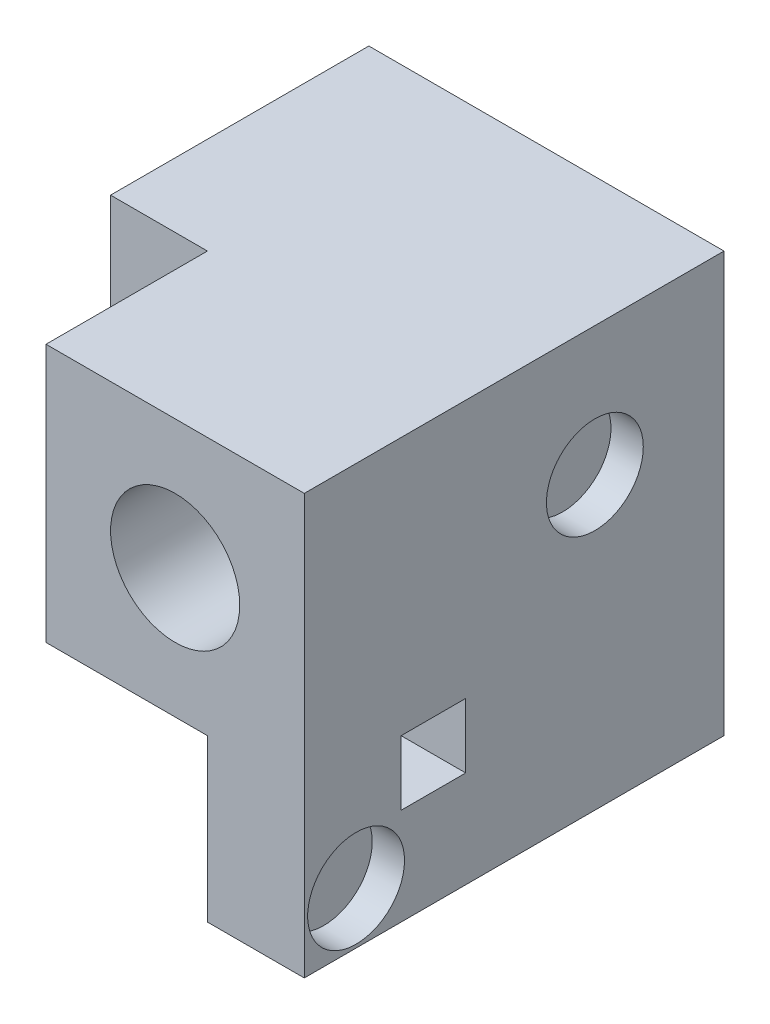
ISO-10303-21;
HEADER;
FILE_DESCRIPTION(('STEP AP214'),'2;1');
FILE_NAME('part.step','',(''),(''),'','','');
FILE_SCHEMA(('AUTOMOTIVE_DESIGN { 1 0 10303 214 1 1 1 1 }'));
ENDSEC;
DATA;
#1=APPLICATION_CONTEXT('core data for automotive mechanical design processes');
#2=APPLICATION_PROTOCOL_DEFINITION('international standard','automotive_design',2000,#1);
#3=PRODUCT_CONTEXT('',#1,'mechanical');
#4=PRODUCT('Part','Part','',(#3));
#5=PRODUCT_RELATED_PRODUCT_CATEGORY('part','',(#4));
#6=PRODUCT_DEFINITION_FORMATION('','',#4);
#7=PRODUCT_DEFINITION_CONTEXT('part definition',#1,'design');
#8=PRODUCT_DEFINITION('design','',#6,#7);
#9=PRODUCT_DEFINITION_SHAPE('','',#8);
#10=(LENGTH_UNIT() NAMED_UNIT(*) SI_UNIT(.MILLI.,.METRE.));
#11=(NAMED_UNIT(*) PLANE_ANGLE_UNIT() SI_UNIT($,.RADIAN.));
#12=(NAMED_UNIT(*) SI_UNIT($,.STERADIAN.) SOLID_ANGLE_UNIT());
#13=UNCERTAINTY_MEASURE_WITH_UNIT(LENGTH_MEASURE(1.E-05),#10,'distance_accuracy_value','');
#14=(GEOMETRIC_REPRESENTATION_CONTEXT(3) GLOBAL_UNCERTAINTY_ASSIGNED_CONTEXT((#13)) GLOBAL_UNIT_ASSIGNED_CONTEXT((#10,
#11,#12)) REPRESENTATION_CONTEXT('',''));
#15=CARTESIAN_POINT('',(0.,0.,0.));
#16=DIRECTION('',(0.,0.,1.));
#17=DIRECTION('',(1.,0.,0.));
#18=AXIS2_PLACEMENT_3D('',#15,#16,#17);
#19=CARTESIAN_POINT('',(-40.,-50.,40.));
#20=DIRECTION('',(0.,0.,-1.));
#21=DIRECTION('',(-1.,0.,0.));
#22=AXIS2_PLACEMENT_3D('',#19,#20,#21);
#23=PLANE('',#22);
#24=DIRECTION('',(-1.,0.,0.));
#25=VECTOR('',#24,1.);
#26=CARTESIAN_POINT('',(40.,-20.,40.));
#27=LINE('',#26,#25);
#28=CARTESIAN_POINT('',(40.,-20.,40.));
#29=VERTEX_POINT('',#28);
#30=CARTESIAN_POINT('',(10.,-20.,40.));
#31=VERTEX_POINT('',#30);
#32=EDGE_CURVE('E130',#29,#31,#27,.T.);
#33=ORIENTED_EDGE('',*,*,#32,.F.);
#34=DIRECTION('',(0.,1.,0.));
#35=VECTOR('',#34,1.);
#36=CARTESIAN_POINT('',(40.,-50.,40.));
#37=LINE('',#36,#35);
#38=CARTESIAN_POINT('',(40.,0.,40.));
#39=VERTEX_POINT('',#38);
#40=EDGE_CURVE('E141',#29,#39,#37,.T.);
#41=ORIENTED_EDGE('',*,*,#40,.T.);
#42=DIRECTION('',(-1.,0.,0.));
#43=VECTOR('',#42,1.);
#44=CARTESIAN_POINT('',(-40.,0.,40.));
#45=LINE('',#44,#43);
#46=CARTESIAN_POINT('',(-40.,0.,40.));
#47=VERTEX_POINT('',#46);
#48=EDGE_CURVE('E224',#39,#47,#45,.T.);
#49=ORIENTED_EDGE('',*,*,#48,.T.);
#50=DIRECTION('',(0.,1.,0.));
#51=VECTOR('',#50,1.);
#52=CARTESIAN_POINT('',(-40.,-50.,40.));
#53=LINE('',#52,#51);
#54=CARTESIAN_POINT('',(-40.,-50.,40.));
#55=VERTEX_POINT('',#54);
#56=EDGE_CURVE('E151',#55,#47,#53,.T.);
#57=ORIENTED_EDGE('',*,*,#56,.F.);
#58=DIRECTION('',(-1.,0.,0.));
#59=VECTOR('',#58,1.);
#60=CARTESIAN_POINT('',(-40.,-50.,40.));
#61=LINE('',#60,#59);
#62=CARTESIAN_POINT('',(10.,-50.,40.));
#63=VERTEX_POINT('',#62);
#64=EDGE_CURVE('E156',#63,#55,#61,.T.);
#65=ORIENTED_EDGE('',*,*,#64,.F.);
#66=DIRECTION('',(0.,-1.,0.));
#67=VECTOR('',#66,1.);
#68=CARTESIAN_POINT('',(10.,-50.,40.));
#69=LINE('',#68,#67);
#70=EDGE_CURVE('E144',#31,#63,#69,.T.);
#71=ORIENTED_EDGE('',*,*,#70,.F.);
#72=EDGE_LOOP('',(#33,#41,#49,#57,#65,#71));
#73=FACE_BOUND('',#72,.T.);
#74=ADVANCED_FACE('F35',(#73),#23,.F.);
#75=CARTESIAN_POINT('',(40.,-50.,60.));
#76=DIRECTION('',(0.,0.,1.));
#77=DIRECTION('',(1.,0.,0.));
#78=AXIS2_PLACEMENT_3D('',#75,#76,#77);
#79=PLANE('',#78);
#80=DIRECTION('',(1.,0.,0.));
#81=VECTOR('',#80,1.);
#82=CARTESIAN_POINT('',(40.,-20.,60.));
#83=LINE('',#82,#81);
#84=CARTESIAN_POINT('',(10.,-20.,60.));
#85=VERTEX_POINT('',#84);
#86=CARTESIAN_POINT('',(40.,-20.,60.));
#87=VERTEX_POINT('',#86);
#88=EDGE_CURVE('E11',#85,#87,#83,.T.);
#89=ORIENTED_EDGE('',*,*,#88,.F.);
#90=DIRECTION('',(0.,1.,0.));
#91=VECTOR('',#90,1.);
#92=CARTESIAN_POINT('',(10.,-50.,60.));
#93=LINE('',#92,#91);
#94=CARTESIAN_POINT('',(10.,0.,60.));
#95=VERTEX_POINT('',#94);
#96=EDGE_CURVE('E247',#85,#95,#93,.T.);
#97=ORIENTED_EDGE('',*,*,#96,.T.);
#98=DIRECTION('',(1.,0.,0.));
#99=VECTOR('',#98,1.);
#100=CARTESIAN_POINT('',(40.,0.,60.));
#101=LINE('',#100,#99);
#102=CARTESIAN_POINT('',(40.,0.,60.));
#103=VERTEX_POINT('',#102);
#104=EDGE_CURVE('E251',#95,#103,#101,.T.);
#105=ORIENTED_EDGE('',*,*,#104,.T.);
#106=DIRECTION('',(0.,1.,0.));
#107=VECTOR('',#106,1.);
#108=CARTESIAN_POINT('',(40.,-50.,60.));
#109=LINE('',#108,#107);
#110=EDGE_CURVE('E249',#87,#103,#109,.T.);
#111=ORIENTED_EDGE('',*,*,#110,.F.);
#112=EDGE_LOOP('',(#89,#97,#105,#111));
#113=FACE_BOUND('',#112,.T.);
#114=ADVANCED_FACE('F301',(#113),#79,.F.);
#115=CARTESIAN_POINT('',(0.,0.,0.));
#116=DIRECTION('',(0.,1.,0.));
#117=DIRECTION('',(0.,0.,1.));
#118=AXIS2_PLACEMENT_3D('',#115,#116,#117);
#119=PLANE('',#118);
#120=DIRECTION('',(0.,0.,-1.));
#121=VECTOR('',#120,1.);
#122=CARTESIAN_POINT('',(10.,0.,90.));
#123=LINE('',#122,#121);
#124=CARTESIAN_POINT('',(10.,0.,90.));
#125=VERTEX_POINT('',#124);
#126=EDGE_CURVE('E136',#125,#95,#123,.T.);
#127=ORIENTED_EDGE('',*,*,#126,.F.);
#128=DIRECTION('',(1.,0.,0.));
#129=VECTOR('',#128,1.);
#130=CARTESIAN_POINT('',(40.,0.,90.));
#131=LINE('',#130,#129);
#132=CARTESIAN_POINT('',(-40.,0.,90.));
#133=VERTEX_POINT('',#132);
#134=EDGE_CURVE('E166',#133,#125,#131,.T.);
#135=ORIENTED_EDGE('',*,*,#134,.F.);
#136=DIRECTION('',(0.,0.,-1.));
#137=VECTOR('',#136,1.);
#138=CARTESIAN_POINT('',(-40.,0.,90.));
#139=LINE('',#138,#137);
#140=EDGE_CURVE('E169',#133,#47,#139,.T.);
#141=ORIENTED_EDGE('',*,*,#140,.T.);
#142=ORIENTED_EDGE('',*,*,#48,.F.);
#143=DIRECTION('',(0.,0.,-1.));
#144=VECTOR('',#143,1.);
#145=CARTESIAN_POINT('',(40.,0.,-40.));
#146=LINE('',#145,#144);
#147=EDGE_CURVE('E148',#103,#39,#146,.T.);
#148=ORIENTED_EDGE('',*,*,#147,.F.);
#149=ORIENTED_EDGE('',*,*,#104,.F.);
#150=EDGE_LOOP('',(#127,#135,#141,#142,#148,#149));
#151=FACE_BOUND('',#150,.T.);
#152=ADVANCED_FACE('F306',(#151),#119,.F.);
#153=DIRECTION('',(0.,0.,-1.));
#154=VECTOR('',#153,1.);
#155=CARTESIAN_POINT('',(-40.,0.,40.));
#156=LINE('',#155,#154);
#157=CARTESIAN_POINT('',(-40.,0.,-40.));
#158=VERTEX_POINT('',#157);
#159=EDGE_CURVE('E222',#47,#158,#156,.T.);
#160=ORIENTED_EDGE('',*,*,#159,.F.);
#161=DIRECTION('',(1.,0.,0.));
#162=VECTOR('',#161,1.);
#163=CARTESIAN_POINT('',(-40.,0.,40.));
#164=LINE('',#163,#162);
#165=CARTESIAN_POINT('',(-70.,0.,40.));
#166=VERTEX_POINT('',#165);
#167=EDGE_CURVE('E192',#166,#47,#164,.T.);
#168=ORIENTED_EDGE('',*,*,#167,.F.);
#169=DIRECTION('',(0.,0.,1.));
#170=VECTOR('',#169,1.);
#171=CARTESIAN_POINT('',(-70.,0.,-40.));
#172=LINE('',#171,#170);
#173=CARTESIAN_POINT('',(-70.,0.,-40.));
#174=VERTEX_POINT('',#173);
#175=EDGE_CURVE('E179',#174,#166,#172,.T.);
#176=ORIENTED_EDGE('',*,*,#175,.F.);
#177=DIRECTION('',(-1.,0.,0.));
#178=VECTOR('',#177,1.);
#179=CARTESIAN_POINT('',(-40.,0.,-40.));
#180=LINE('',#179,#178);
#181=EDGE_CURVE('E58',#158,#174,#180,.T.);
#182=ORIENTED_EDGE('',*,*,#181,.F.);
#183=EDGE_LOOP('',(#160,#168,#176,#182));
#184=FACE_BOUND('',#183,.T.);
#185=ADVANCED_FACE('F332',(#184),#119,.F.);
#186=CARTESIAN_POINT('',(-40.,80.,40.));
#187=DIRECTION('',(0.,0.,-1.));
#188=DIRECTION('',(-1.,0.,0.));
#189=AXIS2_PLACEMENT_3D('',#186,#187,#188);
#190=PLANE('',#189);
#191=DIRECTION('',(0.,-1.,0.));
#192=VECTOR('',#191,1.);
#193=CARTESIAN_POINT('',(-40.,80.,40.));
#194=LINE('',#193,#192);
#195=CARTESIAN_POINT('',(-40.,80.,40.));
#196=VERTEX_POINT('',#195);
#197=EDGE_CURVE('E153',#196,#47,#194,.T.);
#198=ORIENTED_EDGE('',*,*,#197,.F.);
#199=DIRECTION('',(1.,0.,0.));
#200=VECTOR('',#199,1.);
#201=CARTESIAN_POINT('',(-40.,80.,40.));
#202=LINE('',#201,#200);
#203=CARTESIAN_POINT('',(-70.,80.,40.));
#204=VERTEX_POINT('',#203);
#205=EDGE_CURVE('E194',#204,#196,#202,.T.);
#206=ORIENTED_EDGE('',*,*,#205,.F.);
#207=DIRECTION('',(0.,1.,0.));
#208=VECTOR('',#207,1.);
#209=CARTESIAN_POINT('',(-70.,80.,40.));
#210=LINE('',#209,#208);
#211=EDGE_CURVE('E182',#166,#204,#210,.T.);
#212=ORIENTED_EDGE('',*,*,#211,.F.);
#213=ORIENTED_EDGE('',*,*,#167,.T.);
#214=EDGE_LOOP('',(#198,#206,#212,#213));
#215=FACE_BOUND('',#214,.T.);
#216=ADVANCED_FACE('F284',(#215),#190,.F.);
#217=CARTESIAN_POINT('',(40.,80.,-40.));
#218=DIRECTION('',(-1.,0.,0.));
#219=DIRECTION('',(0.,0.,1.));
#220=AXIS2_PLACEMENT_3D('',#217,#218,#219);
#221=PLANE('',#220);
#222=CARTESIAN_POINT('',(40.,-33.9563648810585,73.9563648810586));
#223=DIRECTION('',(1.,0.,0.));
#224=DIRECTION('',(0.,0.,-1.));
#225=AXIS2_PLACEMENT_3D('',#222,#223,#224);
#226=CIRCLE('',#225,15.);
#227=CARTESIAN_POINT('',(40.,-33.9563648810585,58.9563648810586));
#228=VERTEX_POINT('',#227);
#229=EDGE_CURVE('E267',#228,#228,#226,.T.);
#230=ORIENTED_EDGE('',*,*,#229,.F.);
#231=EDGE_LOOP('',(#230));
#232=FACE_BOUND('',#231,.T.);
#233=CARTESIAN_POINT('',(40.,40.,0.));
#234=DIRECTION('',(1.,0.,0.));
#235=DIRECTION('',(0.,0.,-1.));
#236=AXIS2_PLACEMENT_3D('',#233,#234,#235);
#237=CIRCLE('',#236,15.);
#238=CARTESIAN_POINT('',(40.,40.,-15.));
#239=VERTEX_POINT('',#238);
#240=EDGE_CURVE('E261',#239,#239,#237,.T.);
#241=ORIENTED_EDGE('',*,*,#240,.F.);
#242=EDGE_LOOP('',(#241));
#243=FACE_BOUND('',#242,.T.);
#244=DIRECTION('',(0.,0.,-1.));
#245=VECTOR('',#244,1.);
#246=CARTESIAN_POINT('',(40.,80.,-40.));
#247=LINE('',#246,#245);
#248=CARTESIAN_POINT('',(40.,80.,90.));
#249=VERTEX_POINT('',#248);
#250=CARTESIAN_POINT('',(40.,80.,-40.));
#251=VERTEX_POINT('',#250);
#252=EDGE_CURVE('E188',#249,#251,#247,.T.);
#253=ORIENTED_EDGE('',*,*,#252,.F.);
#254=DIRECTION('',(0.,1.,0.));
#255=VECTOR('',#254,1.);
#256=CARTESIAN_POINT('',(40.,80.,90.));
#257=LINE('',#256,#255);
#258=CARTESIAN_POINT('',(40.,-50.,90.));
#259=VERTEX_POINT('',#258);
#260=EDGE_CURVE('E160',#259,#249,#257,.T.);
#261=ORIENTED_EDGE('',*,*,#260,.F.);
#262=DIRECTION('',(0.,0.,1.));
#263=VECTOR('',#262,1.);
#264=CARTESIAN_POINT('',(40.,-50.,40.));
#265=LINE('',#264,#263);
#266=CARTESIAN_POINT('',(40.,-50.,-40.));
#267=VERTEX_POINT('',#266);
#268=EDGE_CURVE('E211',#267,#259,#265,.T.);
#269=ORIENTED_EDGE('',*,*,#268,.F.);
#270=DIRECTION('',(0.,-1.,0.));
#271=VECTOR('',#270,1.);
#272=CARTESIAN_POINT('',(40.,80.,-40.));
#273=LINE('',#272,#271);
#274=EDGE_CURVE('E43',#251,#267,#273,.T.);
#275=ORIENTED_EDGE('',*,*,#274,.F.);
#276=EDGE_LOOP('',(#253,#261,#269,#275));
#277=FACE_BOUND('',#276,.T.);
#278=DIRECTION('',(0.,0.,-1.));
#279=VECTOR('',#278,1.);
#280=CARTESIAN_POINT('',(40.,-20.,90.));
#281=LINE('',#280,#279);
#282=EDGE_CURVE('E127',#87,#29,#281,.T.);
#283=ORIENTED_EDGE('',*,*,#282,.F.);
#284=ORIENTED_EDGE('',*,*,#110,.T.);
#285=ORIENTED_EDGE('',*,*,#147,.T.);
#286=ORIENTED_EDGE('',*,*,#40,.F.);
#287=EDGE_LOOP('',(#283,#284,#285,#286));
#288=FACE_BOUND('',#287,.T.);
#289=ADVANCED_FACE('F37',(#232,#243,#277,#288),#221,.F.);
#290=CARTESIAN_POINT('',(-40.,80.,-40.));
#291=DIRECTION('',(0.,0.,1.));
#292=DIRECTION('',(1.,0.,0.));
#293=AXIS2_PLACEMENT_3D('',#290,#291,#292);
#294=PLANE('',#293);
#295=ORIENTED_EDGE('',*,*,#274,.T.);
#296=DIRECTION('',(1.,0.,0.));
#297=VECTOR('',#296,1.);
#298=CARTESIAN_POINT('',(-40.,-50.,-40.));
#299=LINE('',#298,#297);
#300=CARTESIAN_POINT('',(-40.,-50.,-40.));
#301=VERTEX_POINT('',#300);
#302=EDGE_CURVE('E204',#301,#267,#299,.T.);
#303=ORIENTED_EDGE('',*,*,#302,.F.);
#304=DIRECTION('',(0.,1.,0.));
#305=VECTOR('',#304,1.);
#306=CARTESIAN_POINT('',(-40.,-50.,-40.));
#307=LINE('',#306,#305);
#308=EDGE_CURVE('E150',#301,#158,#307,.T.);
#309=ORIENTED_EDGE('',*,*,#308,.T.);
#310=ORIENTED_EDGE('',*,*,#181,.T.);
#311=DIRECTION('',(0.,-1.,0.));
#312=VECTOR('',#311,1.);
#313=CARTESIAN_POINT('',(-70.,80.,-40.));
#314=LINE('',#313,#312);
#315=CARTESIAN_POINT('',(-70.,80.,-40.));
#316=VERTEX_POINT('',#315);
#317=EDGE_CURVE('E176',#316,#174,#314,.T.);
#318=ORIENTED_EDGE('',*,*,#317,.F.);
#319=DIRECTION('',(-1.,0.,0.));
#320=VECTOR('',#319,1.);
#321=CARTESIAN_POINT('',(-40.,80.,-40.));
#322=LINE('',#321,#320);
#323=EDGE_CURVE('E191',#251,#316,#322,.T.);
#324=ORIENTED_EDGE('',*,*,#323,.F.);
#325=EDGE_LOOP('',(#295,#303,#309,#310,#318,#324));
#326=FACE_BOUND('',#325,.T.);
#327=ADVANCED_FACE('F203',(#326),#294,.F.);
#328=CARTESIAN_POINT('',(0.,80.,0.));
#329=DIRECTION('',(0.,1.,0.));
#330=DIRECTION('',(0.,0.,1.));
#331=AXIS2_PLACEMENT_3D('',#328,#329,#330);
#332=PLANE('',#331);
#333=ORIENTED_EDGE('',*,*,#252,.T.);
#334=ORIENTED_EDGE('',*,*,#323,.T.);
#335=DIRECTION('',(0.,0.,-1.));
#336=VECTOR('',#335,1.);
#337=CARTESIAN_POINT('',(-70.,80.,-40.));
#338=LINE('',#337,#336);
#339=EDGE_CURVE('E185',#204,#316,#338,.T.);
#340=ORIENTED_EDGE('',*,*,#339,.F.);
#341=ORIENTED_EDGE('',*,*,#205,.T.);
#342=DIRECTION('',(0.,0.,-1.));
#343=VECTOR('',#342,1.);
#344=CARTESIAN_POINT('',(-40.,80.,90.));
#345=LINE('',#344,#343);
#346=CARTESIAN_POINT('',(-40.,80.,90.));
#347=VERTEX_POINT('',#346);
#348=EDGE_CURVE('E173',#347,#196,#345,.T.);
#349=ORIENTED_EDGE('',*,*,#348,.F.);
#350=DIRECTION('',(-1.,0.,0.));
#351=VECTOR('',#350,1.);
#352=CARTESIAN_POINT('',(40.,80.,90.));
#353=LINE('',#352,#351);
#354=EDGE_CURVE('E162',#249,#347,#353,.T.);
#355=ORIENTED_EDGE('',*,*,#354,.F.);
#356=EDGE_LOOP('',(#333,#334,#340,#341,#349,#355));
#357=FACE_BOUND('',#356,.T.);
#358=ADVANCED_FACE('F327',(#357),#332,.T.);
#359=CARTESIAN_POINT('',(-70.,0.,0.));
#360=DIRECTION('',(-1.,0.,0.));
#361=DIRECTION('',(0.,0.,1.));
#362=AXIS2_PLACEMENT_3D('',#359,#360,#361);
#363=PLANE('',#362);
#364=CARTESIAN_POINT('',(-70.,40.,0.));
#365=DIRECTION('',(-1.,0.,0.));
#366=DIRECTION('',(0.,0.,1.));
#367=AXIS2_PLACEMENT_3D('',#364,#365,#366);
#368=CIRCLE('',#367,20.);
#369=CARTESIAN_POINT('',(-70.,40.,20.));
#370=VERTEX_POINT('',#369);
#371=EDGE_CURVE('E228',#370,#370,#368,.T.);
#372=ORIENTED_EDGE('',*,*,#371,.F.);
#373=EDGE_LOOP('',(#372));
#374=FACE_BOUND('',#373,.T.);
#375=ORIENTED_EDGE('',*,*,#317,.T.);
#376=ORIENTED_EDGE('',*,*,#175,.T.);
#377=ORIENTED_EDGE('',*,*,#211,.T.);
#378=ORIENTED_EDGE('',*,*,#339,.T.);
#379=EDGE_LOOP('',(#375,#376,#377,#378));
#380=FACE_BOUND('',#379,.T.);
#381=ADVANCED_FACE('F323',(#374,#380),#363,.T.);
#382=CARTESIAN_POINT('',(-40.,80.,90.));
#383=DIRECTION('',(1.,0.,0.));
#384=DIRECTION('',(0.,0.,-1.));
#385=AXIS2_PLACEMENT_3D('',#382,#383,#384);
#386=PLANE('',#385);
#387=ORIENTED_EDGE('',*,*,#197,.T.);
#388=ORIENTED_EDGE('',*,*,#140,.F.);
#389=DIRECTION('',(0.,-1.,0.));
#390=VECTOR('',#389,1.);
#391=CARTESIAN_POINT('',(-40.,80.,90.));
#392=LINE('',#391,#390);
#393=EDGE_CURVE('E164',#347,#133,#392,.T.);
#394=ORIENTED_EDGE('',*,*,#393,.F.);
#395=ORIENTED_EDGE('',*,*,#348,.T.);
#396=EDGE_LOOP('',(#387,#388,#394,#395));
#397=FACE_BOUND('',#396,.T.);
#398=ADVANCED_FACE('F319',(#397),#386,.F.);
#399=CARTESIAN_POINT('',(0.,0.,90.));
#400=DIRECTION('',(0.,0.,-1.));
#401=DIRECTION('',(-1.,0.,0.));
#402=AXIS2_PLACEMENT_3D('',#399,#400,#401);
#403=PLANE('',#402);
#404=ORIENTED_EDGE('',*,*,#260,.T.);
#405=ORIENTED_EDGE('',*,*,#354,.T.);
#406=ORIENTED_EDGE('',*,*,#393,.T.);
#407=ORIENTED_EDGE('',*,*,#134,.T.);
#408=DIRECTION('',(0.,1.,0.));
#409=VECTOR('',#408,1.);
#410=CARTESIAN_POINT('',(10.,-50.,90.));
#411=LINE('',#410,#409);
#412=CARTESIAN_POINT('',(10.,-50.,90.));
#413=VERTEX_POINT('',#412);
#414=EDGE_CURVE('E243',#413,#125,#411,.T.);
#415=ORIENTED_EDGE('',*,*,#414,.F.);
#416=DIRECTION('',(-1.,0.,0.));
#417=VECTOR('',#416,1.);
#418=CARTESIAN_POINT('',(40.,-50.,90.));
#419=LINE('',#418,#417);
#420=EDGE_CURVE('E254',#259,#413,#419,.T.);
#421=ORIENTED_EDGE('',*,*,#420,.F.);
#422=EDGE_LOOP('',(#404,#405,#406,#407,#415,#421));
#423=FACE_BOUND('',#422,.T.);
#424=CARTESIAN_POINT('',(0.,40.,90.));
#425=DIRECTION('',(0.,0.,1.));
#426=DIRECTION('',(1.,0.,0.));
#427=AXIS2_PLACEMENT_3D('',#424,#425,#426);
#428=CIRCLE('',#427,20.);
#429=CARTESIAN_POINT('',(20.,40.,90.));
#430=VERTEX_POINT('',#429);
#431=EDGE_CURVE('E234',#430,#430,#428,.T.);
#432=ORIENTED_EDGE('',*,*,#431,.F.);
#433=EDGE_LOOP('',(#432));
#434=FACE_BOUND('',#433,.T.);
#435=ADVANCED_FACE('F315',(#423,#434),#403,.F.);
#436=CARTESIAN_POINT('',(-40.,-50.,40.));
#437=DIRECTION('',(1.,0.,0.));
#438=DIRECTION('',(0.,0.,-1.));
#439=AXIS2_PLACEMENT_3D('',#436,#437,#438);
#440=PLANE('',#439);
#441=ORIENTED_EDGE('',*,*,#159,.T.);
#442=ORIENTED_EDGE('',*,*,#308,.F.);
#443=DIRECTION('',(0.,0.,-1.));
#444=VECTOR('',#443,1.);
#445=CARTESIAN_POINT('',(-40.,-50.,40.));
#446=LINE('',#445,#444);
#447=EDGE_CURVE('E214',#55,#301,#446,.T.);
#448=ORIENTED_EDGE('',*,*,#447,.F.);
#449=ORIENTED_EDGE('',*,*,#56,.T.);
#450=EDGE_LOOP('',(#441,#442,#448,#449));
#451=FACE_BOUND('',#450,.T.);
#452=ADVANCED_FACE('F312',(#451),#440,.F.);
#453=CARTESIAN_POINT('',(0.,-50.,0.));
#454=DIRECTION('',(0.,-1.,0.));
#455=DIRECTION('',(0.,0.,-1.));
#456=AXIS2_PLACEMENT_3D('',#453,#454,#455);
#457=PLANE('',#456);
#458=CARTESIAN_POINT('',(0.,-50.,0.));
#459=DIRECTION('',(0.,-1.,0.));
#460=DIRECTION('',(0.,0.,-1.));
#461=AXIS2_PLACEMENT_3D('',#458,#459,#460);
#462=CIRCLE('',#461,20.);
#463=CARTESIAN_POINT('',(0.,-50.,-20.));
#464=VERTEX_POINT('',#463);
#465=EDGE_CURVE('E240',#464,#464,#462,.T.);
#466=ORIENTED_EDGE('',*,*,#465,.F.);
#467=EDGE_LOOP('',(#466));
#468=FACE_BOUND('',#467,.T.);
#469=ORIENTED_EDGE('',*,*,#447,.T.);
#470=ORIENTED_EDGE('',*,*,#302,.T.);
#471=ORIENTED_EDGE('',*,*,#268,.T.);
#472=ORIENTED_EDGE('',*,*,#420,.T.);
#473=DIRECTION('',(0.,0.,-1.));
#474=VECTOR('',#473,1.);
#475=CARTESIAN_POINT('',(10.,-50.,90.));
#476=LINE('',#475,#474);
#477=EDGE_CURVE('E50',#413,#63,#476,.T.);
#478=ORIENTED_EDGE('',*,*,#477,.T.);
#479=ORIENTED_EDGE('',*,*,#64,.T.);
#480=EDGE_LOOP('',(#469,#470,#471,#472,#478,#479));
#481=FACE_BOUND('',#480,.T.);
#482=ADVANCED_FACE('F210',(#468,#481),#457,.T.);
#483=CARTESIAN_POINT('',(-25.,40.,0.));
#484=DIRECTION('',(-1.,0.,0.));
#485=DIRECTION('',(0.,0.,1.));
#486=AXIS2_PLACEMENT_3D('',#483,#484,#485);
#487=CYLINDRICAL_SURFACE('',#486,20.);
#488=CARTESIAN_POINT('',(-25.,40.,0.));
#489=DIRECTION('',(-1.,0.,0.));
#490=DIRECTION('',(0.,0.,1.));
#491=AXIS2_PLACEMENT_3D('',#488,#489,#490);
#492=CIRCLE('',#491,20.);
#493=CARTESIAN_POINT('',(-25.,40.,20.));
#494=VERTEX_POINT('',#493);
#495=EDGE_CURVE('E225',#494,#494,#492,.T.);
#496=CARTESIAN_POINT('',(-25.,40.,20.));
#497=CARTESIAN_POINT('',(-25.46875,40.,20.));
#498=CARTESIAN_POINT('',(-25.9375,40.,20.));
#499=CARTESIAN_POINT('',(-26.875,40.,20.));
#500=CARTESIAN_POINT('',(-27.34375,40.,20.));
#501=CARTESIAN_POINT('',(-28.28125,40.,20.));
#502=CARTESIAN_POINT('',(-28.75,40.,20.));
#503=CARTESIAN_POINT('',(-29.6875,40.,20.));
#504=CARTESIAN_POINT('',(-30.15625,40.,20.));
#505=CARTESIAN_POINT('',(-31.09375,40.,20.));
#506=CARTESIAN_POINT('',(-31.5625,40.,20.));
#507=CARTESIAN_POINT('',(-32.5,40.,20.));
#508=CARTESIAN_POINT('',(-32.96875,40.,20.));
#509=CARTESIAN_POINT('',(-33.90625,40.,20.));
#510=CARTESIAN_POINT('',(-34.375,40.,20.));
#511=CARTESIAN_POINT('',(-35.3125,40.,20.));
#512=CARTESIAN_POINT('',(-35.78125,40.,20.));
#513=CARTESIAN_POINT('',(-36.71875,40.,20.));
#514=CARTESIAN_POINT('',(-37.1875,40.,20.));
#515=CARTESIAN_POINT('',(-38.125,40.,20.));
#516=CARTESIAN_POINT('',(-38.59375,40.,20.));
#517=CARTESIAN_POINT('',(-39.53125,40.,20.));
#518=CARTESIAN_POINT('',(-40.,40.,20.));
#519=CARTESIAN_POINT('',(-40.9375,40.,20.));
#520=CARTESIAN_POINT('',(-41.40625,40.,20.));
#521=CARTESIAN_POINT('',(-42.34375,40.,20.));
#522=CARTESIAN_POINT('',(-42.8125,40.,20.));
#523=CARTESIAN_POINT('',(-43.75,40.,20.));
#524=CARTESIAN_POINT('',(-44.21875,40.,20.));
#525=CARTESIAN_POINT('',(-45.15625,40.,20.));
#526=CARTESIAN_POINT('',(-45.625,40.,20.));
#527=CARTESIAN_POINT('',(-46.5625,40.,20.));
#528=CARTESIAN_POINT('',(-47.03125,40.,20.));
#529=CARTESIAN_POINT('',(-47.96875,40.,20.));
#530=CARTESIAN_POINT('',(-48.4375,40.,20.));
#531=CARTESIAN_POINT('',(-49.375,40.,20.));
#532=CARTESIAN_POINT('',(-49.84375,40.,20.));
#533=CARTESIAN_POINT('',(-50.78125,40.,20.));
#534=CARTESIAN_POINT('',(-51.25,40.,20.));
#535=CARTESIAN_POINT('',(-52.1875,40.,20.));
#536=CARTESIAN_POINT('',(-52.65625,40.,20.));
#537=CARTESIAN_POINT('',(-53.59375,40.,20.));
#538=CARTESIAN_POINT('',(-54.0625,40.,20.));
#539=CARTESIAN_POINT('',(-55.,40.,20.));
#540=CARTESIAN_POINT('',(-55.46875,40.,20.));
#541=CARTESIAN_POINT('',(-56.40625,40.,20.));
#542=CARTESIAN_POINT('',(-56.875,40.,20.));
#543=CARTESIAN_POINT('',(-57.8125,40.,20.));
#544=CARTESIAN_POINT('',(-58.28125,40.,20.));
#545=CARTESIAN_POINT('',(-59.21875,40.,20.));
#546=CARTESIAN_POINT('',(-59.6875,40.,20.));
#547=CARTESIAN_POINT('',(-60.625,40.,20.));
#548=CARTESIAN_POINT('',(-61.09375,40.,20.));
#549=CARTESIAN_POINT('',(-62.03125,40.,20.));
#550=CARTESIAN_POINT('',(-62.5,40.,20.));
#551=CARTESIAN_POINT('',(-63.4375,40.,20.));
#552=CARTESIAN_POINT('',(-63.90625,40.,20.));
#553=CARTESIAN_POINT('',(-64.84375,40.,20.));
#554=CARTESIAN_POINT('',(-65.3125,40.,20.));
#555=CARTESIAN_POINT('',(-66.25,40.,20.));
#556=CARTESIAN_POINT('',(-66.71875,40.,20.));
#557=CARTESIAN_POINT('',(-67.65625,40.,20.));
#558=CARTESIAN_POINT('',(-68.125,40.,20.));
#559=CARTESIAN_POINT('',(-69.0625,40.,20.));
#560=CARTESIAN_POINT('',(-69.53125,40.,20.));
#561=CARTESIAN_POINT('',(-70.,40.,20.));
#562=B_SPLINE_CURVE_WITH_KNOTS('',3,(#496,#497,#498,#499,#500,#501,#502,#503,#504,#505,#506,
#507,#508,#509,#510,#511,#512,#513,#514,#515,#516,#517,#518,#519,#520,#521,#522,#523,#524,#525,
#526,#527,#528,#529,#530,#531,#532,#533,#534,#535,#536,#537,#538,#539,#540,#541,#542,#543,#544,
#545,#546,#547,#548,#549,#550,#551,#552,#553,#554,#555,#556,#557,#558,#559,#560,#561),
.UNSPECIFIED.,.F.,.F.,(4,2,2,2,2,2,2,2,2,2,2,2,2,2,2,2,2,2,2,2,2,2,2,2,2,2,2,2,2,2,2,2,4),(0.,
1.40625,2.8125,4.21875,5.625,7.03125,8.4375,9.84375,11.25,12.65625,14.0625,15.46875,16.875,
18.28125,19.6875,21.09375,22.5,23.90625,25.3125,26.71875,28.125,29.53125,30.9375,32.34375,33.75,
35.15625,36.5625,37.96875,39.375,40.78125,42.1875,43.59375,45.),.UNSPECIFIED.);
#563=EDGE_CURVE('BSEAM371',#494,#370,#562,.T.);
#564=ORIENTED_EDGE('',*,*,#495,.F.);
#565=ORIENTED_EDGE('',*,*,#371,.T.);
#566=ORIENTED_EDGE('',*,*,#563,.T.);
#567=ORIENTED_EDGE('',*,*,#563,.F.);
#568=EDGE_LOOP('',(#564,#566,#565,#567));
#569=FACE_BOUND('',#568,.T.);
#570=ADVANCED_FACE('F371',(#569),#487,.F.);
#571=CARTESIAN_POINT('',(-25.,40.,0.));
#572=DIRECTION('',(-1.,0.,0.));
#573=DIRECTION('',(0.,0.,1.));
#574=AXIS2_PLACEMENT_3D('',#571,#572,#573);
#575=PLANE('',#574);
#576=ORIENTED_EDGE('',*,*,#495,.T.);
#577=EDGE_LOOP('',(#576));
#578=FACE_BOUND('',#577,.T.);
#579=ADVANCED_FACE('F377',(#578),#575,.T.);
#580=CARTESIAN_POINT('',(0.,40.,25.));
#581=DIRECTION('',(0.,0.,1.));
#582=DIRECTION('',(1.,0.,0.));
#583=AXIS2_PLACEMENT_3D('',#580,#581,#582);
#584=CYLINDRICAL_SURFACE('',#583,20.);
#585=CARTESIAN_POINT('',(0.,40.,25.));
#586=DIRECTION('',(0.,0.,1.));
#587=DIRECTION('',(1.,0.,0.));
#588=AXIS2_PLACEMENT_3D('',#585,#586,#587);
#589=CIRCLE('',#588,20.);
#590=CARTESIAN_POINT('',(20.,40.,25.));
#591=VERTEX_POINT('',#590);
#592=EDGE_CURVE('E231',#591,#591,#589,.T.);
#593=ORIENTED_EDGE('',*,*,#592,.F.);
#594=EDGE_LOOP('',(#593));
#595=FACE_BOUND('',#594,.T.);
#596=ORIENTED_EDGE('',*,*,#431,.T.);
#597=EDGE_LOOP('',(#596));
#598=FACE_BOUND('',#597,.T.);
#599=ADVANCED_FACE('F384',(#595,#598),#584,.F.);
#600=CARTESIAN_POINT('',(0.,40.,25.));
#601=DIRECTION('',(0.,0.,1.));
#602=DIRECTION('',(1.,0.,0.));
#603=AXIS2_PLACEMENT_3D('',#600,#601,#602);
#604=PLANE('',#603);
#605=ORIENTED_EDGE('',*,*,#592,.T.);
#606=EDGE_LOOP('',(#605));
#607=FACE_BOUND('',#606,.T.);
#608=ADVANCED_FACE('F392',(#607),#604,.T.);
#609=CARTESIAN_POINT('',(0.,15.,0.));
#610=DIRECTION('',(0.,-1.,0.));
#611=DIRECTION('',(0.,0.,-1.));
#612=AXIS2_PLACEMENT_3D('',#609,#610,#611);
#613=CYLINDRICAL_SURFACE('',#612,20.);
#614=CARTESIAN_POINT('',(0.,15.,0.));
#615=DIRECTION('',(0.,-1.,0.));
#616=DIRECTION('',(0.,0.,-1.));
#617=AXIS2_PLACEMENT_3D('',#614,#615,#616);
#618=CIRCLE('',#617,20.);
#619=CARTESIAN_POINT('',(0.,15.,-20.));
#620=VERTEX_POINT('',#619);
#621=EDGE_CURVE('E237',#620,#620,#618,.T.);
#622=ORIENTED_EDGE('',*,*,#621,.F.);
#623=EDGE_LOOP('',(#622));
#624=FACE_BOUND('',#623,.T.);
#625=ORIENTED_EDGE('',*,*,#465,.T.);
#626=EDGE_LOOP('',(#625));
#627=FACE_BOUND('',#626,.T.);
#628=ADVANCED_FACE('F400',(#624,#627),#613,.F.);
#629=CARTESIAN_POINT('',(0.,15.,0.));
#630=DIRECTION('',(0.,-1.,0.));
#631=DIRECTION('',(0.,0.,-1.));
#632=AXIS2_PLACEMENT_3D('',#629,#630,#631);
#633=PLANE('',#632);
#634=ORIENTED_EDGE('',*,*,#621,.T.);
#635=EDGE_LOOP('',(#634));
#636=FACE_BOUND('',#635,.T.);
#637=ADVANCED_FACE('F408',(#636),#633,.T.);
#638=CARTESIAN_POINT('',(10.,-50.,90.));
#639=DIRECTION('',(1.,0.,0.));
#640=DIRECTION('',(0.,0.,-1.));
#641=AXIS2_PLACEMENT_3D('',#638,#639,#640);
#642=PLANE('',#641);
#643=ORIENTED_EDGE('',*,*,#414,.T.);
#644=ORIENTED_EDGE('',*,*,#126,.T.);
#645=ORIENTED_EDGE('',*,*,#96,.F.);
#646=DIRECTION('',(0.,0.,-1.));
#647=VECTOR('',#646,1.);
#648=CARTESIAN_POINT('',(10.,-20.,90.));
#649=LINE('',#648,#647);
#650=EDGE_CURVE('E137',#85,#31,#649,.T.);
#651=ORIENTED_EDGE('',*,*,#650,.T.);
#652=ORIENTED_EDGE('',*,*,#70,.T.);
#653=ORIENTED_EDGE('',*,*,#477,.F.);
#654=EDGE_LOOP('',(#643,#644,#645,#651,#652,#653));
#655=FACE_BOUND('',#654,.T.);
#656=ADVANCED_FACE('F297',(#655),#642,.F.);
#657=CARTESIAN_POINT('',(40.,-20.,90.));
#658=DIRECTION('',(0.,-1.,0.));
#659=DIRECTION('',(0.,0.,-1.));
#660=AXIS2_PLACEMENT_3D('',#657,#658,#659);
#661=PLANE('',#660);
#662=ORIENTED_EDGE('',*,*,#650,.F.);
#663=ORIENTED_EDGE('',*,*,#88,.T.);
#664=ORIENTED_EDGE('',*,*,#282,.T.);
#665=ORIENTED_EDGE('',*,*,#32,.T.);
#666=EDGE_LOOP('',(#662,#663,#664,#665));
#667=FACE_BOUND('',#666,.T.);
#668=ADVANCED_FACE('F129',(#667),#661,.F.);
#669=CARTESIAN_POINT('',(30.,40.,0.));
#670=DIRECTION('',(1.,0.,0.));
#671=DIRECTION('',(0.,0.,-1.));
#672=AXIS2_PLACEMENT_3D('',#669,#670,#671);
#673=CYLINDRICAL_SURFACE('',#672,15.);
#674=CARTESIAN_POINT('',(30.,40.,0.));
#675=DIRECTION('',(1.,0.,0.));
#676=DIRECTION('',(0.,0.,-1.));
#677=AXIS2_PLACEMENT_3D('',#674,#675,#676);
#678=CIRCLE('',#677,15.);
#679=CARTESIAN_POINT('',(30.,40.,-15.));
#680=VERTEX_POINT('',#679);
#681=EDGE_CURVE('E264',#680,#680,#678,.T.);
#682=ORIENTED_EDGE('',*,*,#681,.F.);
#683=EDGE_LOOP('',(#682));
#684=FACE_BOUND('',#683,.T.);
#685=ORIENTED_EDGE('',*,*,#240,.T.);
#686=EDGE_LOOP('',(#685));
#687=FACE_BOUND('',#686,.T.);
#688=ADVANCED_FACE('F287',(#684,#687),#673,.F.);
#689=CARTESIAN_POINT('',(30.,40.,0.));
#690=DIRECTION('',(1.,0.,0.));
#691=DIRECTION('',(0.,0.,-1.));
#692=AXIS2_PLACEMENT_3D('',#689,#690,#691);
#693=PLANE('',#692);
#694=ORIENTED_EDGE('',*,*,#681,.T.);
#695=EDGE_LOOP('',(#694));
#696=FACE_BOUND('',#695,.T.);
#697=ADVANCED_FACE('F278',(#696),#693,.T.);
#698=CARTESIAN_POINT('',(30.,-33.9563648810585,73.9563648810586));
#699=DIRECTION('',(1.,0.,0.));
#700=DIRECTION('',(0.,0.,-1.));
#701=AXIS2_PLACEMENT_3D('',#698,#699,#700);
#702=CYLINDRICAL_SURFACE('',#701,15.);
#703=CARTESIAN_POINT('',(30.,-33.9563648810585,73.9563648810586));
#704=DIRECTION('',(1.,0.,0.));
#705=DIRECTION('',(0.,0.,-1.));
#706=AXIS2_PLACEMENT_3D('',#703,#704,#705);
#707=CIRCLE('',#706,15.);
#708=CARTESIAN_POINT('',(30.,-33.9563648810585,58.9563648810586));
#709=VERTEX_POINT('',#708);
#710=EDGE_CURVE('E145',#709,#709,#707,.T.);
#711=ORIENTED_EDGE('',*,*,#710,.F.);
#712=EDGE_LOOP('',(#711));
#713=FACE_BOUND('',#712,.T.);
#714=ORIENTED_EDGE('',*,*,#229,.T.);
#715=EDGE_LOOP('',(#714));
#716=FACE_BOUND('',#715,.T.);
#717=ADVANCED_FACE('F275',(#713,#716),#702,.F.);
#718=CARTESIAN_POINT('',(30.,-33.9563648810585,73.9563648810586));
#719=DIRECTION('',(1.,0.,0.));
#720=DIRECTION('',(0.,0.,-1.));
#721=AXIS2_PLACEMENT_3D('',#718,#719,#720);
#722=PLANE('',#721);
#723=ORIENTED_EDGE('',*,*,#710,.T.);
#724=EDGE_LOOP('',(#723));
#725=FACE_BOUND('',#724,.T.);
#726=ADVANCED_FACE('F273',(#725),#722,.T.);
#727=CLOSED_SHELL('',(#74,#114,#152,#185,#216,#289,#327,#358,#381,#398,#435,#452,#482,#570,#579,
#599,#608,#628,#637,#656,#668,#688,#697,#717,#726));
#728=MANIFOLD_SOLID_BREP('B2',#727);
#729=ADVANCED_BREP_SHAPE_REPRESENTATION('',(#18,#728),#14);
#730=SHAPE_DEFINITION_REPRESENTATION(#9,#729);
ENDSEC;
END-ISO-10303-21;
